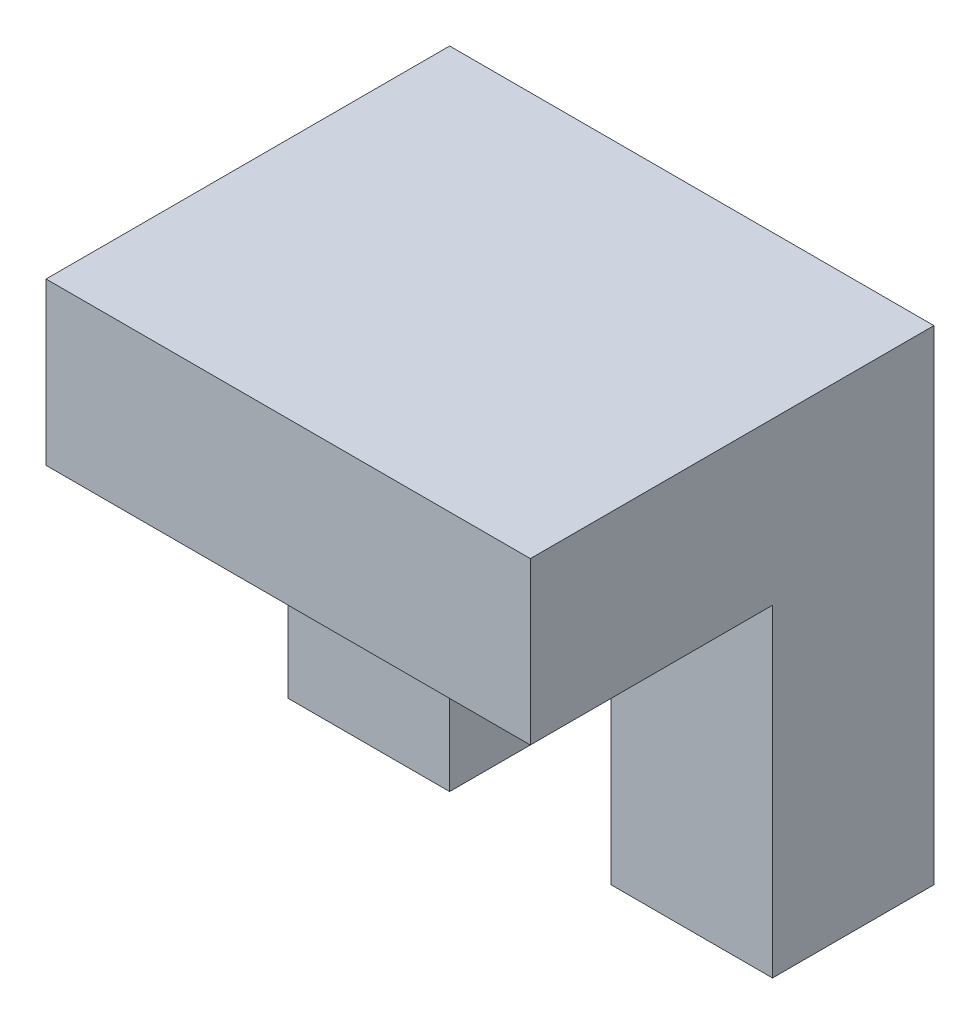
ISO-10303-21;
HEADER;
FILE_DESCRIPTION(('STEP AP214'),'2;1');
FILE_NAME('part.step','',(''),(''),'','','');
FILE_SCHEMA(('AUTOMOTIVE_DESIGN { 1 0 10303 214 1 1 1 1 }'));
ENDSEC;
DATA;
#1=APPLICATION_CONTEXT('core data for automotive mechanical design processes');
#2=APPLICATION_PROTOCOL_DEFINITION('international standard','automotive_design',2000,#1);
#3=PRODUCT_CONTEXT('',#1,'mechanical');
#4=PRODUCT('Part','Part','',(#3));
#5=PRODUCT_RELATED_PRODUCT_CATEGORY('part','',(#4));
#6=PRODUCT_DEFINITION_FORMATION('','',#4);
#7=PRODUCT_DEFINITION_CONTEXT('part definition',#1,'design');
#8=PRODUCT_DEFINITION('design','',#6,#7);
#9=PRODUCT_DEFINITION_SHAPE('','',#8);
#10=(LENGTH_UNIT() NAMED_UNIT(*) SI_UNIT(.MILLI.,.METRE.));
#11=(NAMED_UNIT(*) PLANE_ANGLE_UNIT() SI_UNIT($,.RADIAN.));
#12=(NAMED_UNIT(*) SI_UNIT($,.STERADIAN.) SOLID_ANGLE_UNIT());
#13=UNCERTAINTY_MEASURE_WITH_UNIT(LENGTH_MEASURE(1.E-05),#10,'distance_accuracy_value','');
#14=(GEOMETRIC_REPRESENTATION_CONTEXT(3) GLOBAL_UNCERTAINTY_ASSIGNED_CONTEXT((#13)) GLOBAL_UNIT_ASSIGNED_CONTEXT((#10,
#11,#12)) REPRESENTATION_CONTEXT('',''));
#15=CARTESIAN_POINT('',(0.,0.,0.));
#16=DIRECTION('',(0.,0.,1.));
#17=DIRECTION('',(1.,0.,0.));
#18=AXIS2_PLACEMENT_3D('',#15,#16,#17);
#19=CARTESIAN_POINT('',(0.,0.,20.));
#20=DIRECTION('',(0.,1.,0.));
#21=DIRECTION('',(0.,0.,1.));
#22=AXIS2_PLACEMENT_3D('',#19,#20,#21);
#23=PLANE('',#22);
#24=DIRECTION('',(1.,0.,0.));
#25=VECTOR('',#24,1.);
#26=CARTESIAN_POINT('',(0.,0.,20.));
#27=LINE('',#26,#25);
#28=CARTESIAN_POINT('',(40.,0.,20.));
#29=VERTEX_POINT('',#28);
#30=CARTESIAN_POINT('',(60.,0.,20.));
#31=VERTEX_POINT('',#30);
#32=EDGE_CURVE('E206',#29,#31,#27,.T.);
#33=ORIENTED_EDGE('',*,*,#32,.F.);
#34=DIRECTION('',(0.,0.,1.));
#35=VECTOR('',#34,1.);
#36=CARTESIAN_POINT('',(40.,0.,-20.));
#37=LINE('',#36,#35);
#38=CARTESIAN_POINT('',(40.,0.,0.));
#39=VERTEX_POINT('',#38);
#40=EDGE_CURVE('E197',#39,#29,#37,.T.);
#41=ORIENTED_EDGE('',*,*,#40,.F.);
#42=DIRECTION('',(1.,0.,0.));
#43=VECTOR('',#42,1.);
#44=CARTESIAN_POINT('',(0.,0.,0.));
#45=LINE('',#44,#43);
#46=CARTESIAN_POINT('',(60.,0.,0.));
#47=VERTEX_POINT('',#46);
#48=EDGE_CURVE('E84',#39,#47,#45,.T.);
#49=ORIENTED_EDGE('',*,*,#48,.T.);
#50=DIRECTION('',(0.,0.,-1.));
#51=VECTOR('',#50,1.);
#52=CARTESIAN_POINT('',(60.,0.,20.));
#53=LINE('',#52,#51);
#54=EDGE_CURVE('E138',#31,#47,#53,.T.);
#55=ORIENTED_EDGE('',*,*,#54,.F.);
#56=EDGE_LOOP('',(#33,#41,#49,#55));
#57=FACE_BOUND('',#56,.T.);
#58=ADVANCED_FACE('F43',(#57),#23,.F.);
#59=CARTESIAN_POINT('',(0.,0.,20.));
#60=DIRECTION('',(1.,0.,0.));
#61=DIRECTION('',(0.,0.,-1.));
#62=AXIS2_PLACEMENT_3D('',#59,#60,#61);
#63=PLANE('',#62);
#64=DIRECTION('',(0.,-1.,0.));
#65=VECTOR('',#64,1.);
#66=CARTESIAN_POINT('',(0.,0.,0.));
#67=LINE('',#66,#65);
#68=CARTESIAN_POINT('',(0.,60.,0.));
#69=VERTEX_POINT('',#68);
#70=CARTESIAN_POINT('',(0.,0.,0.));
#71=VERTEX_POINT('',#70);
#72=EDGE_CURVE('E149',#69,#71,#67,.T.);
#73=ORIENTED_EDGE('',*,*,#72,.T.);
#74=DIRECTION('',(0.,0.,-1.));
#75=VECTOR('',#74,1.);
#76=CARTESIAN_POINT('',(0.,0.,20.));
#77=LINE('',#76,#75);
#78=CARTESIAN_POINT('',(0.,0.,20.));
#79=VERTEX_POINT('',#78);
#80=EDGE_CURVE('E223',#79,#71,#77,.T.);
#81=ORIENTED_EDGE('',*,*,#80,.F.);
#82=DIRECTION('',(0.,-1.,0.));
#83=VECTOR('',#82,1.);
#84=CARTESIAN_POINT('',(0.,0.,20.));
#85=LINE('',#84,#83);
#86=CARTESIAN_POINT('',(0.,40.,20.));
#87=VERTEX_POINT('',#86);
#88=EDGE_CURVE('E141',#87,#79,#85,.T.);
#89=ORIENTED_EDGE('',*,*,#88,.F.);
#90=DIRECTION('',(0.,0.,1.));
#91=VECTOR('',#90,1.);
#92=CARTESIAN_POINT('',(0.,40.,0.));
#93=LINE('',#92,#91);
#94=CARTESIAN_POINT('',(0.,40.,50.));
#95=VERTEX_POINT('',#94);
#96=EDGE_CURVE('E68',#87,#95,#93,.T.);
#97=ORIENTED_EDGE('',*,*,#96,.T.);
#98=DIRECTION('',(0.,-1.,0.));
#99=VECTOR('',#98,1.);
#100=CARTESIAN_POINT('',(0.,60.,50.));
#101=LINE('',#100,#99);
#102=CARTESIAN_POINT('',(0.,60.,50.));
#103=VERTEX_POINT('',#102);
#104=EDGE_CURVE('E178',#103,#95,#101,.T.);
#105=ORIENTED_EDGE('',*,*,#104,.F.);
#106=DIRECTION('',(0.,0.,1.));
#107=VECTOR('',#106,1.);
#108=CARTESIAN_POINT('',(0.,60.,0.));
#109=LINE('',#108,#107);
#110=EDGE_CURVE('E153',#69,#103,#109,.T.);
#111=ORIENTED_EDGE('',*,*,#110,.F.);
#112=EDGE_LOOP('',(#73,#81,#89,#97,#105,#111));
#113=FACE_BOUND('',#112,.T.);
#114=ADVANCED_FACE('F45',(#113),#63,.F.);
#115=CARTESIAN_POINT('',(20.,0.,0.));
#116=VERTEX_POINT('',#115);
#117=EDGE_CURVE('E142',#71,#116,#45,.T.);
#118=ORIENTED_EDGE('',*,*,#117,.T.);
#119=DIRECTION('',(0.,0.,1.));
#120=VECTOR('',#119,1.);
#121=CARTESIAN_POINT('',(20.,0.,-20.));
#122=LINE('',#121,#120);
#123=CARTESIAN_POINT('',(20.,0.,20.));
#124=VERTEX_POINT('',#123);
#125=EDGE_CURVE('E59',#116,#124,#122,.T.);
#126=ORIENTED_EDGE('',*,*,#125,.T.);
#127=EDGE_CURVE('E90',#79,#124,#27,.T.);
#128=ORIENTED_EDGE('',*,*,#127,.F.);
#129=ORIENTED_EDGE('',*,*,#80,.T.);
#130=EDGE_LOOP('',(#118,#126,#128,#129));
#131=FACE_BOUND('',#130,.T.);
#132=ADVANCED_FACE('F249',(#131),#23,.F.);
#133=CARTESIAN_POINT('',(60.,0.,20.));
#134=DIRECTION('',(-1.,0.,0.));
#135=DIRECTION('',(0.,0.,1.));
#136=AXIS2_PLACEMENT_3D('',#133,#134,#135);
#137=PLANE('',#136);
#138=DIRECTION('',(0.,1.,0.));
#139=VECTOR('',#138,1.);
#140=CARTESIAN_POINT('',(60.,0.,0.));
#141=LINE('',#140,#139);
#142=CARTESIAN_POINT('',(60.,60.,0.));
#143=VERTEX_POINT('',#142);
#144=EDGE_CURVE('E131',#47,#143,#141,.T.);
#145=ORIENTED_EDGE('',*,*,#144,.T.);
#146=DIRECTION('',(0.,0.,-1.));
#147=VECTOR('',#146,1.);
#148=CARTESIAN_POINT('',(60.,60.,0.));
#149=LINE('',#148,#147);
#150=CARTESIAN_POINT('',(60.,60.,50.));
#151=VERTEX_POINT('',#150);
#152=EDGE_CURVE('E136',#151,#143,#149,.T.);
#153=ORIENTED_EDGE('',*,*,#152,.F.);
#154=DIRECTION('',(0.,-1.,0.));
#155=VECTOR('',#154,1.);
#156=CARTESIAN_POINT('',(60.,60.,50.));
#157=LINE('',#156,#155);
#158=CARTESIAN_POINT('',(60.,40.,50.));
#159=VERTEX_POINT('',#158);
#160=EDGE_CURVE('E169',#151,#159,#157,.T.);
#161=ORIENTED_EDGE('',*,*,#160,.T.);
#162=DIRECTION('',(0.,0.,-1.));
#163=VECTOR('',#162,1.);
#164=CARTESIAN_POINT('',(60.,40.,0.));
#165=LINE('',#164,#163);
#166=CARTESIAN_POINT('',(60.,40.,20.));
#167=VERTEX_POINT('',#166);
#168=EDGE_CURVE('E170',#159,#167,#165,.T.);
#169=ORIENTED_EDGE('',*,*,#168,.T.);
#170=DIRECTION('',(0.,1.,0.));
#171=VECTOR('',#170,1.);
#172=CARTESIAN_POINT('',(60.,0.,20.));
#173=LINE('',#172,#171);
#174=EDGE_CURVE('E209',#31,#167,#173,.T.);
#175=ORIENTED_EDGE('',*,*,#174,.F.);
#176=ORIENTED_EDGE('',*,*,#54,.T.);
#177=EDGE_LOOP('',(#145,#153,#161,#169,#175,#176));
#178=FACE_BOUND('',#177,.T.);
#179=ADVANCED_FACE('F133',(#178),#137,.F.);
#180=CARTESIAN_POINT('',(0.,0.,20.));
#181=DIRECTION('',(0.,0.,-1.));
#182=DIRECTION('',(-1.,0.,0.));
#183=AXIS2_PLACEMENT_3D('',#180,#181,#182);
#184=PLANE('',#183);
#185=DIRECTION('',(-1.,0.,0.));
#186=VECTOR('',#185,1.);
#187=CARTESIAN_POINT('',(20.,20.,20.));
#188=LINE('',#187,#186);
#189=CARTESIAN_POINT('',(40.,20.,20.));
#190=VERTEX_POINT('',#189);
#191=CARTESIAN_POINT('',(20.,20.,20.));
#192=VERTEX_POINT('',#191);
#193=EDGE_CURVE('E182',#190,#192,#188,.T.);
#194=ORIENTED_EDGE('',*,*,#193,.F.);
#195=DIRECTION('',(0.,1.,0.));
#196=VECTOR('',#195,1.);
#197=CARTESIAN_POINT('',(40.,20.,20.));
#198=LINE('',#197,#196);
#199=EDGE_CURVE('E189',#29,#190,#198,.T.);
#200=ORIENTED_EDGE('',*,*,#199,.F.);
#201=ORIENTED_EDGE('',*,*,#32,.T.);
#202=ORIENTED_EDGE('',*,*,#174,.T.);
#203=DIRECTION('',(-1.,0.,0.));
#204=VECTOR('',#203,1.);
#205=CARTESIAN_POINT('',(0.,40.,20.));
#206=LINE('',#205,#204);
#207=EDGE_CURVE('E213',#167,#87,#206,.T.);
#208=ORIENTED_EDGE('',*,*,#207,.T.);
#209=ORIENTED_EDGE('',*,*,#88,.T.);
#210=ORIENTED_EDGE('',*,*,#127,.T.);
#211=DIRECTION('',(0.,-1.,0.));
#212=VECTOR('',#211,1.);
#213=CARTESIAN_POINT('',(20.,0.,20.));
#214=LINE('',#213,#212);
#215=EDGE_CURVE('E186',#192,#124,#214,.T.);
#216=ORIENTED_EDGE('',*,*,#215,.F.);
#217=EDGE_LOOP('',(#194,#200,#201,#202,#208,#209,#210,#216));
#218=FACE_BOUND('',#217,.T.);
#219=ADVANCED_FACE('F242',(#218),#184,.F.);
#220=CARTESIAN_POINT('',(0.,0.,0.));
#221=DIRECTION('',(0.,0.,-1.));
#222=DIRECTION('',(-1.,0.,0.));
#223=AXIS2_PLACEMENT_3D('',#220,#221,#222);
#224=PLANE('',#223);
#225=DIRECTION('',(0.,-1.,0.));
#226=VECTOR('',#225,1.);
#227=CARTESIAN_POINT('',(40.,0.,0.));
#228=LINE('',#227,#226);
#229=CARTESIAN_POINT('',(40.,20.,0.));
#230=VERTEX_POINT('',#229);
#231=EDGE_CURVE('E11',#230,#39,#228,.T.);
#232=ORIENTED_EDGE('',*,*,#231,.F.);
#233=DIRECTION('',(1.,0.,0.));
#234=VECTOR('',#233,1.);
#235=CARTESIAN_POINT('',(0.,20.,0.));
#236=LINE('',#235,#234);
#237=CARTESIAN_POINT('',(20.,20.,0.));
#238=VERTEX_POINT('',#237);
#239=EDGE_CURVE('E52',#238,#230,#236,.T.);
#240=ORIENTED_EDGE('',*,*,#239,.F.);
#241=DIRECTION('',(0.,1.,0.));
#242=VECTOR('',#241,1.);
#243=CARTESIAN_POINT('',(20.,0.,0.));
#244=LINE('',#243,#242);
#245=EDGE_CURVE('E226',#116,#238,#244,.T.);
#246=ORIENTED_EDGE('',*,*,#245,.F.);
#247=ORIENTED_EDGE('',*,*,#117,.F.);
#248=ORIENTED_EDGE('',*,*,#72,.F.);
#249=DIRECTION('',(-1.,0.,0.));
#250=VECTOR('',#249,1.);
#251=CARTESIAN_POINT('',(60.,60.,0.));
#252=LINE('',#251,#250);
#253=EDGE_CURVE('E145',#143,#69,#252,.T.);
#254=ORIENTED_EDGE('',*,*,#253,.F.);
#255=ORIENTED_EDGE('',*,*,#144,.F.);
#256=ORIENTED_EDGE('',*,*,#48,.F.);
#257=EDGE_LOOP('',(#232,#240,#246,#247,#248,#254,#255,#256));
#258=FACE_BOUND('',#257,.T.);
#259=ADVANCED_FACE('F147',(#258),#224,.T.);
#260=CARTESIAN_POINT('',(20.,20.,-20.));
#261=DIRECTION('',(0.,1.,0.));
#262=DIRECTION('',(0.,0.,1.));
#263=AXIS2_PLACEMENT_3D('',#260,#261,#262);
#264=PLANE('',#263);
#265=ORIENTED_EDGE('',*,*,#239,.T.);
#266=DIRECTION('',(0.,0.,1.));
#267=VECTOR('',#266,1.);
#268=CARTESIAN_POINT('',(40.,20.,-20.));
#269=LINE('',#268,#267);
#270=EDGE_CURVE('E194',#230,#190,#269,.T.);
#271=ORIENTED_EDGE('',*,*,#270,.T.);
#272=ORIENTED_EDGE('',*,*,#193,.T.);
#273=DIRECTION('',(0.,0.,1.));
#274=VECTOR('',#273,1.);
#275=CARTESIAN_POINT('',(20.,20.,-20.));
#276=LINE('',#275,#274);
#277=EDGE_CURVE('E193',#238,#192,#276,.T.);
#278=ORIENTED_EDGE('',*,*,#277,.F.);
#279=EDGE_LOOP('',(#265,#271,#272,#278));
#280=FACE_BOUND('',#279,.T.);
#281=ADVANCED_FACE('F233',(#280),#264,.F.);
#282=CARTESIAN_POINT('',(40.,20.,-20.));
#283=DIRECTION('',(1.,0.,0.));
#284=DIRECTION('',(0.,0.,-1.));
#285=AXIS2_PLACEMENT_3D('',#282,#283,#284);
#286=PLANE('',#285);
#287=ORIENTED_EDGE('',*,*,#231,.T.);
#288=ORIENTED_EDGE('',*,*,#40,.T.);
#289=ORIENTED_EDGE('',*,*,#199,.T.);
#290=ORIENTED_EDGE('',*,*,#270,.F.);
#291=EDGE_LOOP('',(#287,#288,#289,#290));
#292=FACE_BOUND('',#291,.T.);
#293=ADVANCED_FACE('F235',(#292),#286,.F.);
#294=CARTESIAN_POINT('',(20.,0.,-20.));
#295=DIRECTION('',(-1.,0.,0.));
#296=DIRECTION('',(0.,0.,1.));
#297=AXIS2_PLACEMENT_3D('',#294,#295,#296);
#298=PLANE('',#297);
#299=ORIENTED_EDGE('',*,*,#245,.T.);
#300=ORIENTED_EDGE('',*,*,#277,.T.);
#301=ORIENTED_EDGE('',*,*,#215,.T.);
#302=ORIENTED_EDGE('',*,*,#125,.F.);
#303=EDGE_LOOP('',(#299,#300,#301,#302));
#304=FACE_BOUND('',#303,.T.);
#305=ADVANCED_FACE('F250',(#304),#298,.F.);
#306=CARTESIAN_POINT('',(0.,40.,0.));
#307=DIRECTION('',(0.,-1.,0.));
#308=DIRECTION('',(0.,0.,-1.));
#309=AXIS2_PLACEMENT_3D('',#306,#307,#308);
#310=PLANE('',#309);
#311=ORIENTED_EDGE('',*,*,#207,.F.);
#312=ORIENTED_EDGE('',*,*,#168,.F.);
#313=DIRECTION('',(1.,0.,0.));
#314=VECTOR('',#313,1.);
#315=CARTESIAN_POINT('',(60.,40.,50.));
#316=LINE('',#315,#314);
#317=EDGE_CURVE('E160',#95,#159,#316,.T.);
#318=ORIENTED_EDGE('',*,*,#317,.F.);
#319=ORIENTED_EDGE('',*,*,#96,.F.);
#320=EDGE_LOOP('',(#311,#312,#318,#319));
#321=FACE_BOUND('',#320,.T.);
#322=ADVANCED_FACE('F244',(#321),#310,.T.);
#323=CARTESIAN_POINT('',(60.,60.,50.));
#324=DIRECTION('',(0.,0.,-1.));
#325=DIRECTION('',(-1.,0.,0.));
#326=AXIS2_PLACEMENT_3D('',#323,#324,#325);
#327=PLANE('',#326);
#328=ORIENTED_EDGE('',*,*,#317,.T.);
#329=ORIENTED_EDGE('',*,*,#160,.F.);
#330=DIRECTION('',(1.,0.,0.));
#331=VECTOR('',#330,1.);
#332=CARTESIAN_POINT('',(60.,60.,50.));
#333=LINE('',#332,#331);
#334=EDGE_CURVE('E157',#103,#151,#333,.T.);
#335=ORIENTED_EDGE('',*,*,#334,.F.);
#336=ORIENTED_EDGE('',*,*,#104,.T.);
#337=EDGE_LOOP('',(#328,#329,#335,#336));
#338=FACE_BOUND('',#337,.T.);
#339=ADVANCED_FACE('F258',(#338),#327,.F.);
#340=CARTESIAN_POINT('',(0.,60.,0.));
#341=DIRECTION('',(0.,-1.,0.));
#342=DIRECTION('',(0.,0.,-1.));
#343=AXIS2_PLACEMENT_3D('',#340,#341,#342);
#344=PLANE('',#343);
#345=ORIENTED_EDGE('',*,*,#152,.T.);
#346=ORIENTED_EDGE('',*,*,#253,.T.);
#347=ORIENTED_EDGE('',*,*,#110,.T.);
#348=ORIENTED_EDGE('',*,*,#334,.T.);
#349=EDGE_LOOP('',(#345,#346,#347,#348));
#350=FACE_BOUND('',#349,.T.);
#351=ADVANCED_FACE('F155',(#350),#344,.F.);
#352=CLOSED_SHELL('',(#58,#114,#132,#179,#219,#259,#281,#293,#305,#322,#339,#351));
#353=MANIFOLD_SOLID_BREP('B2',#352);
#354=ADVANCED_BREP_SHAPE_REPRESENTATION('',(#18,#353),#14);
#355=SHAPE_DEFINITION_REPRESENTATION(#9,#354);
ENDSEC;
END-ISO-10303-21;
